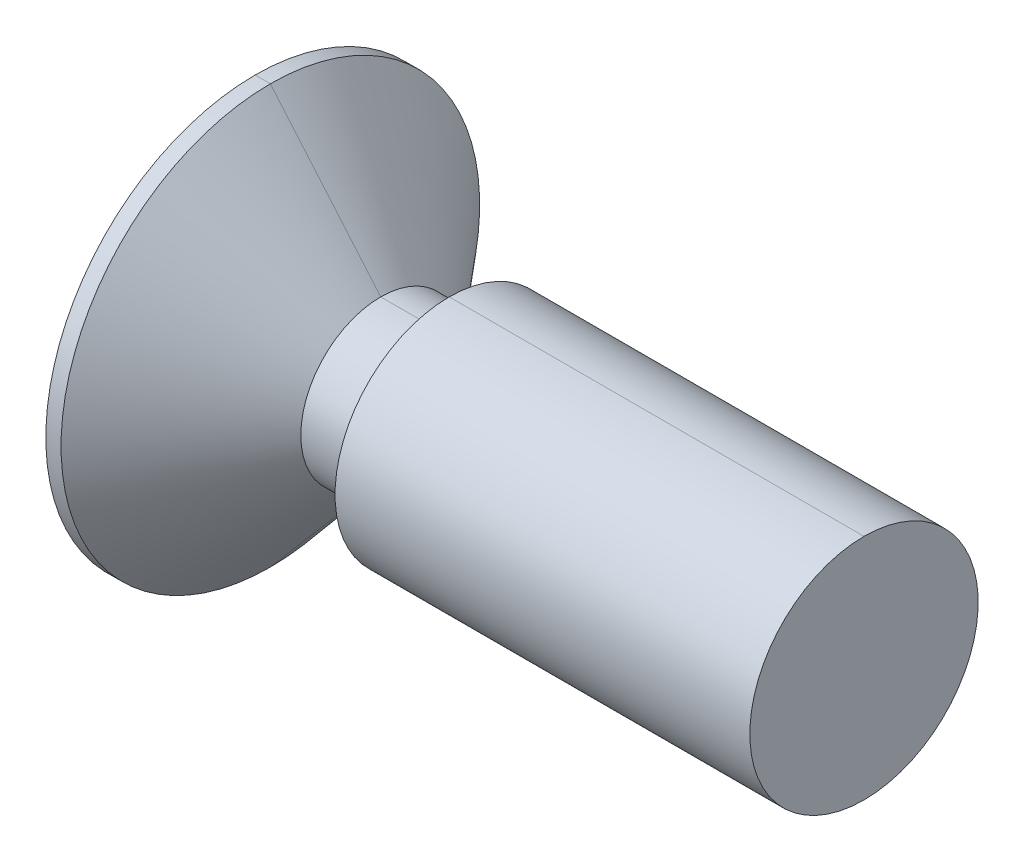
ISO-10303-21;
HEADER;
FILE_DESCRIPTION(('STEP AP214'),'2;1');
FILE_NAME('part.step','',(''),(''),'','','');
FILE_SCHEMA(('AUTOMOTIVE_DESIGN { 1 0 10303 214 1 1 1 1 }'));
ENDSEC;
DATA;
#1=APPLICATION_CONTEXT('core data for automotive mechanical design processes');
#2=APPLICATION_PROTOCOL_DEFINITION('international standard','automotive_design',2000,#1);
#3=PRODUCT_CONTEXT('',#1,'mechanical');
#4=PRODUCT('Part','Part','',(#3));
#5=PRODUCT_RELATED_PRODUCT_CATEGORY('part','',(#4));
#6=PRODUCT_DEFINITION_FORMATION('','',#4);
#7=PRODUCT_DEFINITION_CONTEXT('part definition',#1,'design');
#8=PRODUCT_DEFINITION('design','',#6,#7);
#9=PRODUCT_DEFINITION_SHAPE('','',#8);
#10=(LENGTH_UNIT() NAMED_UNIT(*) SI_UNIT(.MILLI.,.METRE.));
#11=(NAMED_UNIT(*) PLANE_ANGLE_UNIT() SI_UNIT($,.RADIAN.));
#12=(NAMED_UNIT(*) SI_UNIT($,.STERADIAN.) SOLID_ANGLE_UNIT());
#13=UNCERTAINTY_MEASURE_WITH_UNIT(LENGTH_MEASURE(1.E-05),#10,'distance_accuracy_value','');
#14=(GEOMETRIC_REPRESENTATION_CONTEXT(3) GLOBAL_UNCERTAINTY_ASSIGNED_CONTEXT((#13)) GLOBAL_UNIT_ASSIGNED_CONTEXT((#10,
#11,#12)) REPRESENTATION_CONTEXT('',''));
#15=CARTESIAN_POINT('',(0.,0.,0.));
#16=DIRECTION('',(0.,0.,1.));
#17=DIRECTION('',(1.,0.,0.));
#18=AXIS2_PLACEMENT_3D('',#15,#16,#17);
#19=CARTESIAN_POINT('',(-7.175,0.675,-0.675));
#20=DIRECTION('',(1.,0.,0.));
#21=DIRECTION('',(0.,1.,0.));
#22=AXIS2_PLACEMENT_3D('',#19,#20,#21);
#23=PLANE('',#22);
#24=DIRECTION('',(0.,-1.,0.));
#25=VECTOR('',#24,1.);
#26=CARTESIAN_POINT('',(-7.175,1.8,-0.375));
#27=LINE('',#26,#25);
#28=CARTESIAN_POINT('',(-7.175,1.8,-0.375));
#29=VERTEX_POINT('',#28);
#30=CARTESIAN_POINT('',(-7.175,0.675,-0.375));
#31=VERTEX_POINT('',#30);
#32=EDGE_CURVE('E343',#29,#31,#27,.T.);
#33=ORIENTED_EDGE('',*,*,#32,.T.);
#34=CARTESIAN_POINT('',(-7.175,0.675,-0.675));
#35=DIRECTION('',(1.,0.,0.));
#36=DIRECTION('',(0.,1.,0.));
#37=AXIS2_PLACEMENT_3D('',#34,#35,#36);
#38=CIRCLE('',#37,0.3);
#39=CARTESIAN_POINT('',(-7.175,0.375,-0.675));
#40=VERTEX_POINT('',#39);
#41=EDGE_CURVE('E10',#31,#40,#38,.T.);
#42=ORIENTED_EDGE('',*,*,#41,.T.);
#43=DIRECTION('',(0.,0.,-1.));
#44=VECTOR('',#43,1.);
#45=CARTESIAN_POINT('',(-7.175,0.375,-1.8));
#46=LINE('',#45,#44);
#47=CARTESIAN_POINT('',(-7.175,0.375,-1.8));
#48=VERTEX_POINT('',#47);
#49=EDGE_CURVE('E345',#40,#48,#46,.T.);
#50=ORIENTED_EDGE('',*,*,#49,.T.);
#51=DIRECTION('',(0.,-1.,0.));
#52=VECTOR('',#51,1.);
#53=CARTESIAN_POINT('',(-7.175,0.375,-1.8));
#54=LINE('',#53,#52);
#55=CARTESIAN_POINT('',(-7.175,-0.375,-1.8));
#56=VERTEX_POINT('',#55);
#57=EDGE_CURVE('E281',#48,#56,#54,.T.);
#58=ORIENTED_EDGE('',*,*,#57,.T.);
#59=DIRECTION('',(0.,0.,1.));
#60=VECTOR('',#59,1.);
#61=CARTESIAN_POINT('',(-7.175,-0.375,-1.8));
#62=LINE('',#61,#60);
#63=CARTESIAN_POINT('',(-7.175,-0.375,-0.675));
#64=VERTEX_POINT('',#63);
#65=EDGE_CURVE('E20',#56,#64,#62,.T.);
#66=ORIENTED_EDGE('',*,*,#65,.T.);
#67=CARTESIAN_POINT('',(-7.175,-0.675,-0.675));
#68=DIRECTION('',(1.,0.,0.));
#69=DIRECTION('',(0.,-1.,0.));
#70=AXIS2_PLACEMENT_3D('',#67,#68,#69);
#71=CIRCLE('',#70,0.3);
#72=CARTESIAN_POINT('',(-7.175,-0.675,-0.375));
#73=VERTEX_POINT('',#72);
#74=EDGE_CURVE('E277',#64,#73,#71,.T.);
#75=ORIENTED_EDGE('',*,*,#74,.T.);
#76=DIRECTION('',(0.,-1.,0.));
#77=VECTOR('',#76,1.);
#78=CARTESIAN_POINT('',(-7.175,-0.675,-0.375));
#79=LINE('',#78,#77);
#80=CARTESIAN_POINT('',(-7.175,-1.8,-0.375));
#81=VERTEX_POINT('',#80);
#82=EDGE_CURVE('E270',#73,#81,#79,.T.);
#83=ORIENTED_EDGE('',*,*,#82,.T.);
#84=DIRECTION('',(0.,0.,1.));
#85=VECTOR('',#84,1.);
#86=CARTESIAN_POINT('',(-7.175,-1.8,-0.375));
#87=LINE('',#86,#85);
#88=CARTESIAN_POINT('',(-7.175,-1.8,0.375));
#89=VERTEX_POINT('',#88);
#90=EDGE_CURVE('E365',#81,#89,#87,.T.);
#91=ORIENTED_EDGE('',*,*,#90,.T.);
#92=DIRECTION('',(0.,1.,0.));
#93=VECTOR('',#92,1.);
#94=CARTESIAN_POINT('',(-7.175,-0.675,0.375));
#95=LINE('',#94,#93);
#96=CARTESIAN_POINT('',(-7.175,-0.675,0.375));
#97=VERTEX_POINT('',#96);
#98=EDGE_CURVE('E366',#89,#97,#95,.T.);
#99=ORIENTED_EDGE('',*,*,#98,.T.);
#100=CARTESIAN_POINT('',(-7.175,-0.675,0.675));
#101=DIRECTION('',(1.,0.,0.));
#102=DIRECTION('',(0.,1.,0.));
#103=AXIS2_PLACEMENT_3D('',#100,#101,#102);
#104=CIRCLE('',#103,0.3);
#105=CARTESIAN_POINT('',(-7.175,-0.375,0.675));
#106=VERTEX_POINT('',#105);
#107=EDGE_CURVE('E295',#97,#106,#104,.T.);
#108=ORIENTED_EDGE('',*,*,#107,.T.);
#109=DIRECTION('',(0.,0.,1.));
#110=VECTOR('',#109,1.);
#111=CARTESIAN_POINT('',(-7.175,-0.375,0.675));
#112=LINE('',#111,#110);
#113=CARTESIAN_POINT('',(-7.175,-0.375,1.8));
#114=VERTEX_POINT('',#113);
#115=EDGE_CURVE('E296',#106,#114,#112,.T.);
#116=ORIENTED_EDGE('',*,*,#115,.T.);
#117=DIRECTION('',(0.,1.,0.));
#118=VECTOR('',#117,1.);
#119=CARTESIAN_POINT('',(-7.175,0.375,1.8));
#120=LINE('',#119,#118);
#121=CARTESIAN_POINT('',(-7.175,0.375,1.8));
#122=VERTEX_POINT('',#121);
#123=EDGE_CURVE('E259',#114,#122,#120,.T.);
#124=ORIENTED_EDGE('',*,*,#123,.T.);
#125=DIRECTION('',(0.,0.,-1.));
#126=VECTOR('',#125,1.);
#127=CARTESIAN_POINT('',(-7.175,0.375,0.675));
#128=LINE('',#127,#126);
#129=CARTESIAN_POINT('',(-7.175,0.375,0.675));
#130=VERTEX_POINT('',#129);
#131=EDGE_CURVE('E304',#122,#130,#128,.T.);
#132=ORIENTED_EDGE('',*,*,#131,.T.);
#133=CARTESIAN_POINT('',(-7.175,0.675,0.675));
#134=DIRECTION('',(1.,0.,0.));
#135=DIRECTION('',(0.,1.,0.));
#136=AXIS2_PLACEMENT_3D('',#133,#134,#135);
#137=CIRCLE('',#136,0.3);
#138=CARTESIAN_POINT('',(-7.175,0.675,0.375));
#139=VERTEX_POINT('',#138);
#140=EDGE_CURVE('E389',#130,#139,#137,.T.);
#141=ORIENTED_EDGE('',*,*,#140,.T.);
#142=DIRECTION('',(0.,1.,0.));
#143=VECTOR('',#142,1.);
#144=CARTESIAN_POINT('',(-7.175,1.8,0.375));
#145=LINE('',#144,#143);
#146=CARTESIAN_POINT('',(-7.175,1.8,0.375));
#147=VERTEX_POINT('',#146);
#148=EDGE_CURVE('E327',#139,#147,#145,.T.);
#149=ORIENTED_EDGE('',*,*,#148,.T.);
#150=DIRECTION('',(0.,0.,-1.));
#151=VECTOR('',#150,1.);
#152=CARTESIAN_POINT('',(-7.175,1.8,-0.375));
#153=LINE('',#152,#151);
#154=EDGE_CURVE('E312',#147,#29,#153,.T.);
#155=ORIENTED_EDGE('',*,*,#154,.T.);
#156=EDGE_LOOP('',(#33,#42,#50,#58,#66,#75,#83,#91,#99,#108,#116,#124,#132,#141,#149,#155));
#157=FACE_BOUND('',#156,.T.);
#158=ADVANCED_FACE('F16',(#157),#23,.F.);
#159=CARTESIAN_POINT('',(-7.175,0.675,-0.675));
#160=DIRECTION('',(-1.,0.,0.));
#161=DIRECTION('',(0.,-1.,0.));
#162=AXIS2_PLACEMENT_3D('',#159,#160,#161);
#163=CYLINDRICAL_SURFACE('',#162,0.3);
#164=CARTESIAN_POINT('',(-8.,0.675,-0.675));
#165=DIRECTION('',(1.,0.,0.));
#166=DIRECTION('',(0.,1.,0.));
#167=AXIS2_PLACEMENT_3D('',#164,#165,#166);
#168=CIRCLE('',#167,0.3);
#169=CARTESIAN_POINT('',(-8.,0.675,-0.375));
#170=VERTEX_POINT('',#169);
#171=CARTESIAN_POINT('',(-8.,0.375,-0.675));
#172=VERTEX_POINT('',#171);
#173=EDGE_CURVE('E344',#170,#172,#168,.T.);
#174=ORIENTED_EDGE('',*,*,#173,.T.);
#175=DIRECTION('',(-1.,0.,0.));
#176=VECTOR('',#175,1.);
#177=CARTESIAN_POINT('',(-7.175,0.375,-0.675));
#178=LINE('',#177,#176);
#179=EDGE_CURVE('E27',#40,#172,#178,.T.);
#180=ORIENTED_EDGE('',*,*,#179,.F.);
#181=ORIENTED_EDGE('',*,*,#41,.F.);
#182=DIRECTION('',(-1.,0.,0.));
#183=VECTOR('',#182,1.);
#184=CARTESIAN_POINT('',(-7.175,0.675,-0.375));
#185=LINE('',#184,#183);
#186=EDGE_CURVE('E340',#31,#170,#185,.T.);
#187=ORIENTED_EDGE('',*,*,#186,.T.);
#188=EDGE_LOOP('',(#174,#180,#181,#187));
#189=FACE_BOUND('',#188,.T.);
#190=ADVANCED_FACE('F475',(#189),#163,.T.);
#191=CARTESIAN_POINT('',(-7.175,0.375,-1.8));
#192=DIRECTION('',(0.,1.,0.));
#193=DIRECTION('',(1.,0.,0.));
#194=AXIS2_PLACEMENT_3D('',#191,#192,#193);
#195=PLANE('',#194);
#196=DIRECTION('',(0.,0.,-1.));
#197=VECTOR('',#196,1.);
#198=CARTESIAN_POINT('',(-8.,0.375,-1.8));
#199=LINE('',#198,#197);
#200=CARTESIAN_POINT('',(-8.,0.375,-1.8));
#201=VERTEX_POINT('',#200);
#202=EDGE_CURVE('E321',#172,#201,#199,.T.);
#203=ORIENTED_EDGE('',*,*,#202,.T.);
#204=DIRECTION('',(-1.,0.,0.));
#205=VECTOR('',#204,1.);
#206=CARTESIAN_POINT('',(-7.175,0.375,-1.8));
#207=LINE('',#206,#205);
#208=EDGE_CURVE('E290',#48,#201,#207,.T.);
#209=ORIENTED_EDGE('',*,*,#208,.F.);
#210=ORIENTED_EDGE('',*,*,#49,.F.);
#211=ORIENTED_EDGE('',*,*,#179,.T.);
#212=EDGE_LOOP('',(#203,#209,#210,#211));
#213=FACE_BOUND('',#212,.T.);
#214=ADVANCED_FACE('F482',(#213),#195,.F.);
#215=CARTESIAN_POINT('',(-7.175,0.375,-1.8));
#216=DIRECTION('',(0.,0.,-1.));
#217=DIRECTION('',(0.,-1.,0.));
#218=AXIS2_PLACEMENT_3D('',#215,#216,#217);
#219=PLANE('',#218);
#220=DIRECTION('',(0.,-1.,0.));
#221=VECTOR('',#220,1.);
#222=CARTESIAN_POINT('',(-8.,0.375,-1.8));
#223=LINE('',#222,#221);
#224=CARTESIAN_POINT('',(-8.,-0.375,-1.8));
#225=VERTEX_POINT('',#224);
#226=EDGE_CURVE('E317',#201,#225,#223,.T.);
#227=ORIENTED_EDGE('',*,*,#226,.T.);
#228=DIRECTION('',(-1.,0.,0.));
#229=VECTOR('',#228,1.);
#230=CARTESIAN_POINT('',(-7.175,-0.375,-1.8));
#231=LINE('',#230,#229);
#232=EDGE_CURVE('E278',#56,#225,#231,.T.);
#233=ORIENTED_EDGE('',*,*,#232,.F.);
#234=ORIENTED_EDGE('',*,*,#57,.F.);
#235=ORIENTED_EDGE('',*,*,#208,.T.);
#236=EDGE_LOOP('',(#227,#233,#234,#235));
#237=FACE_BOUND('',#236,.T.);
#238=ADVANCED_FACE('F488',(#237),#219,.F.);
#239=CARTESIAN_POINT('',(-7.175,-0.375,-1.8));
#240=DIRECTION('',(0.,-1.,0.));
#241=DIRECTION('',(0.,0.,-1.));
#242=AXIS2_PLACEMENT_3D('',#239,#240,#241);
#243=PLANE('',#242);
#244=DIRECTION('',(0.,0.,1.));
#245=VECTOR('',#244,1.);
#246=CARTESIAN_POINT('',(-8.,-0.375,-1.8));
#247=LINE('',#246,#245);
#248=CARTESIAN_POINT('',(-8.,-0.375,-0.675));
#249=VERTEX_POINT('',#248);
#250=EDGE_CURVE('E322',#225,#249,#247,.T.);
#251=ORIENTED_EDGE('',*,*,#250,.T.);
#252=DIRECTION('',(-1.,0.,0.));
#253=VECTOR('',#252,1.);
#254=CARTESIAN_POINT('',(-7.175,-0.375,-0.675));
#255=LINE('',#254,#253);
#256=EDGE_CURVE('E336',#64,#249,#255,.T.);
#257=ORIENTED_EDGE('',*,*,#256,.F.);
#258=ORIENTED_EDGE('',*,*,#65,.F.);
#259=ORIENTED_EDGE('',*,*,#232,.T.);
#260=EDGE_LOOP('',(#251,#257,#258,#259));
#261=FACE_BOUND('',#260,.T.);
#262=ADVANCED_FACE('F490',(#261),#243,.F.);
#263=CARTESIAN_POINT('',(-7.175,-0.675,-0.675));
#264=DIRECTION('',(-1.,0.,0.));
#265=DIRECTION('',(0.,-1.,0.));
#266=AXIS2_PLACEMENT_3D('',#263,#264,#265);
#267=CYLINDRICAL_SURFACE('',#266,0.3);
#268=CARTESIAN_POINT('',(-8.,-0.675,-0.675));
#269=DIRECTION('',(1.,0.,0.));
#270=DIRECTION('',(0.,-1.,0.));
#271=AXIS2_PLACEMENT_3D('',#268,#269,#270);
#272=CIRCLE('',#271,0.3);
#273=CARTESIAN_POINT('',(-8.,-0.675,-0.375));
#274=VERTEX_POINT('',#273);
#275=EDGE_CURVE('E257',#249,#274,#272,.T.);
#276=ORIENTED_EDGE('',*,*,#275,.T.);
#277=DIRECTION('',(-1.,0.,0.));
#278=VECTOR('',#277,1.);
#279=CARTESIAN_POINT('',(-7.175,-0.675,-0.375));
#280=LINE('',#279,#278);
#281=EDGE_CURVE('E273',#73,#274,#280,.T.);
#282=ORIENTED_EDGE('',*,*,#281,.F.);
#283=ORIENTED_EDGE('',*,*,#74,.F.);
#284=ORIENTED_EDGE('',*,*,#256,.T.);
#285=EDGE_LOOP('',(#276,#282,#283,#284));
#286=FACE_BOUND('',#285,.T.);
#287=ADVANCED_FACE('F646',(#286),#267,.T.);
#288=CARTESIAN_POINT('',(-7.175,-0.675,-0.375));
#289=DIRECTION('',(0.,0.,-1.));
#290=DIRECTION('',(0.,-1.,0.));
#291=AXIS2_PLACEMENT_3D('',#288,#289,#290);
#292=PLANE('',#291);
#293=DIRECTION('',(0.,-1.,0.));
#294=VECTOR('',#293,1.);
#295=CARTESIAN_POINT('',(-8.,-0.675,-0.375));
#296=LINE('',#295,#294);
#297=CARTESIAN_POINT('',(-8.,-1.8,-0.375));
#298=VERTEX_POINT('',#297);
#299=EDGE_CURVE('E253',#274,#298,#296,.T.);
#300=ORIENTED_EDGE('',*,*,#299,.T.);
#301=DIRECTION('',(-1.,0.,0.));
#302=VECTOR('',#301,1.);
#303=CARTESIAN_POINT('',(-7.175,-1.8,-0.375));
#304=LINE('',#303,#302);
#305=EDGE_CURVE('E274',#81,#298,#304,.T.);
#306=ORIENTED_EDGE('',*,*,#305,.F.);
#307=ORIENTED_EDGE('',*,*,#82,.F.);
#308=ORIENTED_EDGE('',*,*,#281,.T.);
#309=EDGE_LOOP('',(#300,#306,#307,#308));
#310=FACE_BOUND('',#309,.T.);
#311=ADVANCED_FACE('F634',(#310),#292,.F.);
#312=CARTESIAN_POINT('',(-7.175,-1.8,-0.375));
#313=DIRECTION('',(0.,-1.,0.));
#314=DIRECTION('',(0.,0.,-1.));
#315=AXIS2_PLACEMENT_3D('',#312,#313,#314);
#316=PLANE('',#315);
#317=DIRECTION('',(0.,0.,1.));
#318=VECTOR('',#317,1.);
#319=CARTESIAN_POINT('',(-8.,-1.8,-0.375));
#320=LINE('',#319,#318);
#321=CARTESIAN_POINT('',(-8.,-1.8,0.375));
#322=VERTEX_POINT('',#321);
#323=EDGE_CURVE('E258',#298,#322,#320,.T.);
#324=ORIENTED_EDGE('',*,*,#323,.T.);
#325=DIRECTION('',(-1.,0.,0.));
#326=VECTOR('',#325,1.);
#327=CARTESIAN_POINT('',(-7.175,-1.8,0.375));
#328=LINE('',#327,#326);
#329=EDGE_CURVE('E362',#89,#322,#328,.T.);
#330=ORIENTED_EDGE('',*,*,#329,.F.);
#331=ORIENTED_EDGE('',*,*,#90,.F.);
#332=ORIENTED_EDGE('',*,*,#305,.T.);
#333=EDGE_LOOP('',(#324,#330,#331,#332));
#334=FACE_BOUND('',#333,.T.);
#335=ADVANCED_FACE('F565',(#334),#316,.F.);
#336=CARTESIAN_POINT('',(-7.175,-0.675,0.375));
#337=DIRECTION('',(0.,0.,1.));
#338=DIRECTION('',(0.,-1.,0.));
#339=AXIS2_PLACEMENT_3D('',#336,#337,#338);
#340=PLANE('',#339);
#341=DIRECTION('',(0.,1.,0.));
#342=VECTOR('',#341,1.);
#343=CARTESIAN_POINT('',(-8.,-0.675,0.375));
#344=LINE('',#343,#342);
#345=CARTESIAN_POINT('',(-8.,-0.675,0.375));
#346=VERTEX_POINT('',#345);
#347=EDGE_CURVE('E246',#322,#346,#344,.T.);
#348=ORIENTED_EDGE('',*,*,#347,.T.);
#349=DIRECTION('',(-1.,0.,0.));
#350=VECTOR('',#349,1.);
#351=CARTESIAN_POINT('',(-7.175,-0.675,0.375));
#352=LINE('',#351,#350);
#353=EDGE_CURVE('E333',#97,#346,#352,.T.);
#354=ORIENTED_EDGE('',*,*,#353,.F.);
#355=ORIENTED_EDGE('',*,*,#98,.F.);
#356=ORIENTED_EDGE('',*,*,#329,.T.);
#357=EDGE_LOOP('',(#348,#354,#355,#356));
#358=FACE_BOUND('',#357,.T.);
#359=ADVANCED_FACE('F445',(#358),#340,.F.);
#360=CARTESIAN_POINT('',(-7.175,-0.675,0.675));
#361=DIRECTION('',(-1.,0.,0.));
#362=DIRECTION('',(0.,-1.,0.));
#363=AXIS2_PLACEMENT_3D('',#360,#361,#362);
#364=CYLINDRICAL_SURFACE('',#363,0.3);
#365=CARTESIAN_POINT('',(-8.,-0.675,0.675));
#366=DIRECTION('',(1.,0.,0.));
#367=DIRECTION('',(0.,1.,0.));
#368=AXIS2_PLACEMENT_3D('',#365,#366,#367);
#369=CIRCLE('',#368,0.3);
#370=CARTESIAN_POINT('',(-8.,-0.375,0.675));
#371=VERTEX_POINT('',#370);
#372=EDGE_CURVE('E268',#346,#371,#369,.T.);
#373=ORIENTED_EDGE('',*,*,#372,.T.);
#374=DIRECTION('',(-1.,0.,0.));
#375=VECTOR('',#374,1.);
#376=CARTESIAN_POINT('',(-7.175,-0.375,0.675));
#377=LINE('',#376,#375);
#378=EDGE_CURVE('E291',#106,#371,#377,.T.);
#379=ORIENTED_EDGE('',*,*,#378,.F.);
#380=ORIENTED_EDGE('',*,*,#107,.F.);
#381=ORIENTED_EDGE('',*,*,#353,.T.);
#382=EDGE_LOOP('',(#373,#379,#380,#381));
#383=FACE_BOUND('',#382,.T.);
#384=ADVANCED_FACE('F438',(#383),#364,.T.);
#385=CARTESIAN_POINT('',(-7.175,-0.375,0.675));
#386=DIRECTION('',(0.,-1.,0.));
#387=DIRECTION('',(0.,0.,-1.));
#388=AXIS2_PLACEMENT_3D('',#385,#386,#387);
#389=PLANE('',#388);
#390=DIRECTION('',(0.,0.,1.));
#391=VECTOR('',#390,1.);
#392=CARTESIAN_POINT('',(-8.,-0.375,0.675));
#393=LINE('',#392,#391);
#394=CARTESIAN_POINT('',(-8.,-0.375,1.8));
#395=VERTEX_POINT('',#394);
#396=EDGE_CURVE('E264',#371,#395,#393,.T.);
#397=ORIENTED_EDGE('',*,*,#396,.T.);
#398=DIRECTION('',(-1.,0.,0.));
#399=VECTOR('',#398,1.);
#400=CARTESIAN_POINT('',(-7.175,-0.375,1.8));
#401=LINE('',#400,#399);
#402=EDGE_CURVE('E262',#114,#395,#401,.T.);
#403=ORIENTED_EDGE('',*,*,#402,.F.);
#404=ORIENTED_EDGE('',*,*,#115,.F.);
#405=ORIENTED_EDGE('',*,*,#378,.T.);
#406=EDGE_LOOP('',(#397,#403,#404,#405));
#407=FACE_BOUND('',#406,.T.);
#408=ADVANCED_FACE('F506',(#407),#389,.F.);
#409=CARTESIAN_POINT('',(-7.175,0.375,1.8));
#410=DIRECTION('',(0.,0.,1.));
#411=DIRECTION('',(1.,0.,0.));
#412=AXIS2_PLACEMENT_3D('',#409,#410,#411);
#413=PLANE('',#412);
#414=DIRECTION('',(0.,1.,0.));
#415=VECTOR('',#414,1.);
#416=CARTESIAN_POINT('',(-8.,0.375,1.8));
#417=LINE('',#416,#415);
#418=CARTESIAN_POINT('',(-8.,0.375,1.8));
#419=VERTEX_POINT('',#418);
#420=EDGE_CURVE('E269',#395,#419,#417,.T.);
#421=ORIENTED_EDGE('',*,*,#420,.T.);
#422=DIRECTION('',(-1.,0.,0.));
#423=VECTOR('',#422,1.);
#424=CARTESIAN_POINT('',(-7.175,0.375,1.8));
#425=LINE('',#424,#423);
#426=EDGE_CURVE('E263',#122,#419,#425,.T.);
#427=ORIENTED_EDGE('',*,*,#426,.F.);
#428=ORIENTED_EDGE('',*,*,#123,.F.);
#429=ORIENTED_EDGE('',*,*,#402,.T.);
#430=EDGE_LOOP('',(#421,#427,#428,#429));
#431=FACE_BOUND('',#430,.T.);
#432=ADVANCED_FACE('F500',(#431),#413,.F.);
#433=CARTESIAN_POINT('',(-7.175,0.375,0.675));
#434=DIRECTION('',(0.,1.,0.));
#435=DIRECTION('',(0.,0.,-1.));
#436=AXIS2_PLACEMENT_3D('',#433,#434,#435);
#437=PLANE('',#436);
#438=DIRECTION('',(0.,0.,-1.));
#439=VECTOR('',#438,1.);
#440=CARTESIAN_POINT('',(-8.,0.375,0.675));
#441=LINE('',#440,#439);
#442=CARTESIAN_POINT('',(-8.,0.375,0.675));
#443=VERTEX_POINT('',#442);
#444=EDGE_CURVE('E416',#419,#443,#441,.T.);
#445=ORIENTED_EDGE('',*,*,#444,.T.);
#446=DIRECTION('',(-1.,0.,0.));
#447=VECTOR('',#446,1.);
#448=CARTESIAN_POINT('',(-7.175,0.375,0.675));
#449=LINE('',#448,#447);
#450=EDGE_CURVE('E392',#130,#443,#449,.T.);
#451=ORIENTED_EDGE('',*,*,#450,.F.);
#452=ORIENTED_EDGE('',*,*,#131,.F.);
#453=ORIENTED_EDGE('',*,*,#426,.T.);
#454=EDGE_LOOP('',(#445,#451,#452,#453));
#455=FACE_BOUND('',#454,.T.);
#456=ADVANCED_FACE('F505',(#455),#437,.F.);
#457=CARTESIAN_POINT('',(-7.175,0.675,0.675));
#458=DIRECTION('',(-1.,0.,0.));
#459=DIRECTION('',(0.,-1.,0.));
#460=AXIS2_PLACEMENT_3D('',#457,#458,#459);
#461=CYLINDRICAL_SURFACE('',#460,0.3);
#462=CARTESIAN_POINT('',(-8.,0.675,0.675));
#463=DIRECTION('',(1.,0.,0.));
#464=DIRECTION('',(0.,1.,0.));
#465=AXIS2_PLACEMENT_3D('',#462,#463,#464);
#466=CIRCLE('',#465,0.3);
#467=CARTESIAN_POINT('',(-8.,0.675,0.375));
#468=VERTEX_POINT('',#467);
#469=EDGE_CURVE('E427',#443,#468,#466,.T.);
#470=ORIENTED_EDGE('',*,*,#469,.T.);
#471=DIRECTION('',(-1.,0.,0.));
#472=VECTOR('',#471,1.);
#473=CARTESIAN_POINT('',(-7.175,0.675,0.375));
#474=LINE('',#473,#472);
#475=EDGE_CURVE('E386',#139,#468,#474,.T.);
#476=ORIENTED_EDGE('',*,*,#475,.F.);
#477=ORIENTED_EDGE('',*,*,#140,.F.);
#478=ORIENTED_EDGE('',*,*,#450,.T.);
#479=EDGE_LOOP('',(#470,#476,#477,#478));
#480=FACE_BOUND('',#479,.T.);
#481=ADVANCED_FACE('F719',(#480),#461,.T.);
#482=CARTESIAN_POINT('',(-7.175,1.8,0.375));
#483=DIRECTION('',(0.,0.,1.));
#484=DIRECTION('',(0.,-1.,0.));
#485=AXIS2_PLACEMENT_3D('',#482,#483,#484);
#486=PLANE('',#485);
#487=DIRECTION('',(0.,1.,0.));
#488=VECTOR('',#487,1.);
#489=CARTESIAN_POINT('',(-8.,1.8,0.375));
#490=LINE('',#489,#488);
#491=CARTESIAN_POINT('',(-8.,1.8,0.375));
#492=VERTEX_POINT('',#491);
#493=EDGE_CURVE('E251',#468,#492,#490,.T.);
#494=ORIENTED_EDGE('',*,*,#493,.T.);
#495=DIRECTION('',(-1.,0.,0.));
#496=VECTOR('',#495,1.);
#497=CARTESIAN_POINT('',(-7.175,1.8,0.375));
#498=LINE('',#497,#496);
#499=EDGE_CURVE('E315',#147,#492,#498,.T.);
#500=ORIENTED_EDGE('',*,*,#499,.F.);
#501=ORIENTED_EDGE('',*,*,#148,.F.);
#502=ORIENTED_EDGE('',*,*,#475,.T.);
#503=EDGE_LOOP('',(#494,#500,#501,#502));
#504=FACE_BOUND('',#503,.T.);
#505=ADVANCED_FACE('F601',(#504),#486,.F.);
#506=CARTESIAN_POINT('',(-7.175,1.8,-0.375));
#507=DIRECTION('',(0.,1.,0.));
#508=DIRECTION('',(0.,0.,-1.));
#509=AXIS2_PLACEMENT_3D('',#506,#507,#508);
#510=PLANE('',#509);
#511=DIRECTION('',(0.,0.,-1.));
#512=VECTOR('',#511,1.);
#513=CARTESIAN_POINT('',(-8.,1.8,-0.375));
#514=LINE('',#513,#512);
#515=CARTESIAN_POINT('',(-8.,1.8,-0.375));
#516=VERTEX_POINT('',#515);
#517=EDGE_CURVE('E248',#492,#516,#514,.T.);
#518=ORIENTED_EDGE('',*,*,#517,.T.);
#519=DIRECTION('',(-1.,0.,0.));
#520=VECTOR('',#519,1.);
#521=CARTESIAN_POINT('',(-7.175,1.8,-0.375));
#522=LINE('',#521,#520);
#523=EDGE_CURVE('E316',#29,#516,#522,.T.);
#524=ORIENTED_EDGE('',*,*,#523,.F.);
#525=ORIENTED_EDGE('',*,*,#154,.F.);
#526=ORIENTED_EDGE('',*,*,#499,.T.);
#527=EDGE_LOOP('',(#518,#524,#525,#526));
#528=FACE_BOUND('',#527,.T.);
#529=ADVANCED_FACE('F522',(#528),#510,.F.);
#530=CARTESIAN_POINT('',(-7.175,1.8,-0.375));
#531=DIRECTION('',(0.,0.,-1.));
#532=DIRECTION('',(0.,-1.,0.));
#533=AXIS2_PLACEMENT_3D('',#530,#531,#532);
#534=PLANE('',#533);
#535=DIRECTION('',(0.,-1.,0.));
#536=VECTOR('',#535,1.);
#537=CARTESIAN_POINT('',(-8.,1.8,-0.375));
#538=LINE('',#537,#536);
#539=EDGE_CURVE('E252',#516,#170,#538,.T.);
#540=ORIENTED_EDGE('',*,*,#539,.T.);
#541=ORIENTED_EDGE('',*,*,#186,.F.);
#542=ORIENTED_EDGE('',*,*,#32,.F.);
#543=ORIENTED_EDGE('',*,*,#523,.T.);
#544=EDGE_LOOP('',(#540,#541,#542,#543));
#545=FACE_BOUND('',#544,.T.);
#546=ADVANCED_FACE('F517',(#545),#534,.F.);
#547=CARTESIAN_POINT('',(-8.,2.75,0.));
#548=DIRECTION('',(-1.,0.,0.));
#549=DIRECTION('',(0.,1.,0.));
#550=AXIS2_PLACEMENT_3D('',#547,#548,#549);
#551=PLANE('',#550);
#552=ORIENTED_EDGE('',*,*,#539,.F.);
#553=ORIENTED_EDGE('',*,*,#517,.F.);
#554=ORIENTED_EDGE('',*,*,#493,.F.);
#555=ORIENTED_EDGE('',*,*,#469,.F.);
#556=ORIENTED_EDGE('',*,*,#444,.F.);
#557=ORIENTED_EDGE('',*,*,#420,.F.);
#558=ORIENTED_EDGE('',*,*,#396,.F.);
#559=ORIENTED_EDGE('',*,*,#372,.F.);
#560=ORIENTED_EDGE('',*,*,#347,.F.);
#561=ORIENTED_EDGE('',*,*,#323,.F.);
#562=ORIENTED_EDGE('',*,*,#299,.F.);
#563=ORIENTED_EDGE('',*,*,#275,.F.);
#564=ORIENTED_EDGE('',*,*,#250,.F.);
#565=ORIENTED_EDGE('',*,*,#226,.F.);
#566=ORIENTED_EDGE('',*,*,#202,.F.);
#567=ORIENTED_EDGE('',*,*,#173,.F.);
#568=EDGE_LOOP('',(#552,#553,#554,#555,#556,#557,#558,#559,#560,#561,#562,#563,#564,#565,#566,#567));
#569=FACE_BOUND('',#568,.T.);
#570=CARTESIAN_POINT('',(-8.,0.,0.));
#571=DIRECTION('',(1.,0.,0.));
#572=DIRECTION('',(0.,1.,0.));
#573=AXIS2_PLACEMENT_3D('',#570,#571,#572);
#574=CIRCLE('',#573,2.75);
#575=CARTESIAN_POINT('',(-8.,2.75,0.));
#576=VERTEX_POINT('',#575);
#577=CARTESIAN_POINT('',(-8.,-2.75,0.));
#578=VERTEX_POINT('',#577);
#579=EDGE_CURVE('E354',#576,#578,#574,.T.);
#580=ORIENTED_EDGE('',*,*,#579,.F.);
#581=CARTESIAN_POINT('',(-8.,0.,0.));
#582=DIRECTION('',(1.,0.,0.));
#583=DIRECTION('',(0.,1.,0.));
#584=AXIS2_PLACEMENT_3D('',#581,#582,#583);
#585=CIRCLE('',#584,2.75);
#586=EDGE_CURVE('E285',#578,#576,#585,.T.);
#587=ORIENTED_EDGE('',*,*,#586,.F.);
#588=EDGE_LOOP('',(#580,#587));
#589=FACE_BOUND('',#588,.T.);
#590=ADVANCED_FACE('F450',(#569,#589),#551,.T.);
#591=CARTESIAN_POINT('',(0.,0.,0.));
#592=DIRECTION('',(1.,0.,0.));
#593=DIRECTION('',(0.,1.,0.));
#594=AXIS2_PLACEMENT_3D('',#591,#592,#593);
#595=CYLINDRICAL_SURFACE('',#594,2.75);
#596=DIRECTION('',(1.,0.,0.));
#597=VECTOR('',#596,1.);
#598=CARTESIAN_POINT('',(0.,-2.75,0.));
#599=LINE('',#598,#597);
#600=CARTESIAN_POINT('',(-7.8,-2.75,0.));
#601=VERTEX_POINT('',#600);
#602=EDGE_CURVE('E350',#578,#601,#599,.T.);
#603=ORIENTED_EDGE('',*,*,#602,.F.);
#604=ORIENTED_EDGE('',*,*,#586,.T.);
#605=DIRECTION('',(1.,0.,0.));
#606=VECTOR('',#605,1.);
#607=CARTESIAN_POINT('',(0.,2.75,0.));
#608=LINE('',#607,#606);
#609=CARTESIAN_POINT('',(-7.8,2.75,0.));
#610=VERTEX_POINT('',#609);
#611=EDGE_CURVE('E403',#576,#610,#608,.T.);
#612=ORIENTED_EDGE('',*,*,#611,.T.);
#613=CARTESIAN_POINT('',(-7.8,0.,0.));
#614=DIRECTION('',(1.,0.,0.));
#615=DIRECTION('',(0.,1.,0.));
#616=AXIS2_PLACEMENT_3D('',#613,#614,#615);
#617=CIRCLE('',#616,2.75);
#618=EDGE_CURVE('E337',#601,#610,#617,.T.);
#619=ORIENTED_EDGE('',*,*,#618,.F.);
#620=EDGE_LOOP('',(#603,#604,#612,#619));
#621=FACE_BOUND('',#620,.T.);
#622=ADVANCED_FACE('F623',(#621),#595,.T.);
#623=CARTESIAN_POINT('',(-6.35,0.,0.));
#624=DIRECTION('',(-1.,0.,0.));
#625=DIRECTION('',(0.,-1.,0.));
#626=AXIS2_PLACEMENT_3D('',#623,#624,#625);
#627=CONICAL_SURFACE('',#626,1.05,0.8645972343669);
#628=DIRECTION('',(-0.64894660608275,0.760833951959086,0.));
#629=VECTOR('',#628,1.);
#630=CARTESIAN_POINT('',(-6.35,1.05,0.));
#631=LINE('',#630,#629);
#632=CARTESIAN_POINT('',(-6.35,1.05,0.));
#633=VERTEX_POINT('',#632);
#634=EDGE_CURVE('E306',#633,#610,#631,.T.);
#635=ORIENTED_EDGE('',*,*,#634,.F.);
#636=CARTESIAN_POINT('',(-6.35,0.,0.));
#637=DIRECTION('',(1.,0.,0.));
#638=DIRECTION('',(0.,1.,0.));
#639=AXIS2_PLACEMENT_3D('',#636,#637,#638);
#640=CIRCLE('',#639,1.05);
#641=CARTESIAN_POINT('',(-6.35,-1.05,0.));
#642=VERTEX_POINT('',#641);
#643=EDGE_CURVE('E100',#642,#633,#640,.T.);
#644=ORIENTED_EDGE('',*,*,#643,.F.);
#645=DIRECTION('',(-0.64894660608275,-0.760833951959086,0.));
#646=VECTOR('',#645,1.);
#647=CARTESIAN_POINT('',(-6.35,-1.05,0.));
#648=LINE('',#647,#646);
#649=EDGE_CURVE('E310',#642,#601,#648,.T.);
#650=ORIENTED_EDGE('',*,*,#649,.T.);
#651=ORIENTED_EDGE('',*,*,#618,.T.);
#652=EDGE_LOOP('',(#635,#644,#650,#651));
#653=FACE_BOUND('',#652,.T.);
#654=ADVANCED_FACE('F537',(#653),#627,.T.);
#655=CARTESIAN_POINT('',(0.,0.,0.));
#656=DIRECTION('',(1.,0.,0.));
#657=DIRECTION('',(0.,1.,0.));
#658=AXIS2_PLACEMENT_3D('',#655,#656,#657);
#659=CYLINDRICAL_SURFACE('',#658,1.05);
#660=DIRECTION('',(1.,0.,0.));
#661=VECTOR('',#660,1.);
#662=CARTESIAN_POINT('',(0.,-1.05,0.));
#663=LINE('',#662,#661);
#664=CARTESIAN_POINT('',(-5.45,-1.05,0.));
#665=VERTEX_POINT('',#664);
#666=EDGE_CURVE('E299',#642,#665,#663,.T.);
#667=ORIENTED_EDGE('',*,*,#666,.F.);
#668=ORIENTED_EDGE('',*,*,#643,.T.);
#669=DIRECTION('',(1.,0.,0.));
#670=VECTOR('',#669,1.);
#671=CARTESIAN_POINT('',(0.,1.05,0.));
#672=LINE('',#671,#670);
#673=CARTESIAN_POINT('',(-5.45,1.05,0.));
#674=VERTEX_POINT('',#673);
#675=EDGE_CURVE('E235',#633,#674,#672,.T.);
#676=ORIENTED_EDGE('',*,*,#675,.T.);
#677=CARTESIAN_POINT('',(-5.45,0.,0.));
#678=DIRECTION('',(1.,0.,0.));
#679=DIRECTION('',(0.,1.,0.));
#680=AXIS2_PLACEMENT_3D('',#677,#678,#679);
#681=CIRCLE('',#680,1.05);
#682=EDGE_CURVE('E86',#665,#674,#681,.T.);
#683=ORIENTED_EDGE('',*,*,#682,.F.);
#684=EDGE_LOOP('',(#667,#668,#676,#683));
#685=FACE_BOUND('',#684,.T.);
#686=ADVANCED_FACE('F532',(#685),#659,.T.);
#687=CARTESIAN_POINT('',(-5.45,1.5,0.));
#688=DIRECTION('',(-1.,0.,0.));
#689=DIRECTION('',(0.,1.,0.));
#690=AXIS2_PLACEMENT_3D('',#687,#688,#689);
#691=PLANE('',#690);
#692=CARTESIAN_POINT('',(-5.45,0.,0.));
#693=DIRECTION('',(1.,0.,0.));
#694=DIRECTION('',(0.,1.,0.));
#695=AXIS2_PLACEMENT_3D('',#692,#693,#694);
#696=CIRCLE('',#695,1.05);
#697=EDGE_CURVE('E242',#674,#665,#696,.T.);
#698=ORIENTED_EDGE('',*,*,#697,.T.);
#699=ORIENTED_EDGE('',*,*,#682,.T.);
#700=EDGE_LOOP('',(#698,#699));
#701=FACE_BOUND('',#700,.T.);
#702=CARTESIAN_POINT('',(-5.45,0.,0.));
#703=DIRECTION('',(1.,0.,0.));
#704=DIRECTION('',(0.,1.,0.));
#705=AXIS2_PLACEMENT_3D('',#702,#703,#704);
#706=CIRCLE('',#705,1.5);
#707=CARTESIAN_POINT('',(-5.45,1.5,0.));
#708=VERTEX_POINT('',#707);
#709=CARTESIAN_POINT('',(-5.45,-1.5,0.));
#710=VERTEX_POINT('',#709);
#711=EDGE_CURVE('E217',#708,#710,#706,.T.);
#712=ORIENTED_EDGE('',*,*,#711,.F.);
#713=CARTESIAN_POINT('',(-5.45,0.,0.));
#714=DIRECTION('',(1.,0.,0.));
#715=DIRECTION('',(0.,1.,0.));
#716=AXIS2_PLACEMENT_3D('',#713,#714,#715);
#717=CIRCLE('',#716,1.5);
#718=EDGE_CURVE('E213',#710,#708,#717,.T.);
#719=ORIENTED_EDGE('',*,*,#718,.F.);
#720=EDGE_LOOP('',(#712,#719));
#721=FACE_BOUND('',#720,.T.);
#722=ADVANCED_FACE('F215',(#701,#721),#691,.T.);
#723=CARTESIAN_POINT('',(0.,0.,0.));
#724=DIRECTION('',(1.,0.,0.));
#725=DIRECTION('',(0.,1.,0.));
#726=AXIS2_PLACEMENT_3D('',#723,#724,#725);
#727=CYLINDRICAL_SURFACE('',#726,1.5);
#728=DIRECTION('',(1.,0.,0.));
#729=VECTOR('',#728,1.);
#730=CARTESIAN_POINT('',(0.,-1.5,0.));
#731=LINE('',#730,#729);
#732=CARTESIAN_POINT('',(0.,-1.5,0.));
#733=VERTEX_POINT('',#732);
#734=EDGE_CURVE('E225',#710,#733,#731,.T.);
#735=ORIENTED_EDGE('',*,*,#734,.F.);
#736=ORIENTED_EDGE('',*,*,#718,.T.);
#737=DIRECTION('',(1.,0.,0.));
#738=VECTOR('',#737,1.);
#739=CARTESIAN_POINT('',(0.,1.5,0.));
#740=LINE('',#739,#738);
#741=CARTESIAN_POINT('',(0.,1.5,0.));
#742=VERTEX_POINT('',#741);
#743=EDGE_CURVE('E233',#708,#742,#740,.T.);
#744=ORIENTED_EDGE('',*,*,#743,.T.);
#745=CARTESIAN_POINT('',(0.,0.,0.));
#746=DIRECTION('',(1.,0.,0.));
#747=DIRECTION('',(0.,1.,0.));
#748=AXIS2_PLACEMENT_3D('',#745,#746,#747);
#749=CIRCLE('',#748,1.5);
#750=EDGE_CURVE('E222',#733,#742,#749,.T.);
#751=ORIENTED_EDGE('',*,*,#750,.F.);
#752=EDGE_LOOP('',(#735,#736,#744,#751));
#753=FACE_BOUND('',#752,.T.);
#754=ADVANCED_FACE('F18',(#753),#727,.T.);
#755=CARTESIAN_POINT('',(0.,0.,0.));
#756=DIRECTION('',(1.,0.,0.));
#757=DIRECTION('',(0.,1.,0.));
#758=AXIS2_PLACEMENT_3D('',#755,#756,#757);
#759=PLANE('',#758);
#760=CARTESIAN_POINT('',(0.,0.,0.));
#761=DIRECTION('',(1.,0.,0.));
#762=DIRECTION('',(0.,1.,0.));
#763=AXIS2_PLACEMENT_3D('',#760,#761,#762);
#764=CIRCLE('',#763,1.5);
#765=EDGE_CURVE('E230',#742,#733,#764,.T.);
#766=ORIENTED_EDGE('',*,*,#765,.T.);
#767=ORIENTED_EDGE('',*,*,#750,.T.);
#768=EDGE_LOOP('',(#766,#767));
#769=FACE_BOUND('',#768,.T.);
#770=ADVANCED_FACE('F655',(#769),#759,.T.);
#771=CARTESIAN_POINT('',(0.,0.,0.));
#772=DIRECTION('',(1.,0.,0.));
#773=DIRECTION('',(0.,1.,0.));
#774=AXIS2_PLACEMENT_3D('',#771,#772,#773);
#775=CYLINDRICAL_SURFACE('',#774,1.5);
#776=ORIENTED_EDGE('',*,*,#711,.T.);
#777=ORIENTED_EDGE('',*,*,#734,.T.);
#778=ORIENTED_EDGE('',*,*,#765,.F.);
#779=ORIENTED_EDGE('',*,*,#743,.F.);
#780=EDGE_LOOP('',(#776,#777,#778,#779));
#781=FACE_BOUND('',#780,.T.);
#782=ADVANCED_FACE('F232',(#781),#775,.T.);
#783=CARTESIAN_POINT('',(0.,0.,0.));
#784=DIRECTION('',(1.,0.,0.));
#785=DIRECTION('',(0.,1.,0.));
#786=AXIS2_PLACEMENT_3D('',#783,#784,#785);
#787=CYLINDRICAL_SURFACE('',#786,1.05);
#788=CARTESIAN_POINT('',(-6.35,0.,0.));
#789=DIRECTION('',(1.,0.,0.));
#790=DIRECTION('',(0.,1.,0.));
#791=AXIS2_PLACEMENT_3D('',#788,#789,#790);
#792=CIRCLE('',#791,1.05);
#793=EDGE_CURVE('E311',#633,#642,#792,.T.);
#794=ORIENTED_EDGE('',*,*,#793,.T.);
#795=ORIENTED_EDGE('',*,*,#666,.T.);
#796=ORIENTED_EDGE('',*,*,#697,.F.);
#797=ORIENTED_EDGE('',*,*,#675,.F.);
#798=EDGE_LOOP('',(#794,#795,#796,#797));
#799=FACE_BOUND('',#798,.T.);
#800=ADVANCED_FACE('F546',(#799),#787,.T.);
#801=CARTESIAN_POINT('',(-6.35,0.,0.));
#802=DIRECTION('',(-1.,0.,0.));
#803=DIRECTION('',(0.,-1.,0.));
#804=AXIS2_PLACEMENT_3D('',#801,#802,#803);
#805=CONICAL_SURFACE('',#804,1.05,0.8645972343669);
#806=ORIENTED_EDGE('',*,*,#793,.F.);
#807=ORIENTED_EDGE('',*,*,#634,.T.);
#808=CARTESIAN_POINT('',(-7.8,0.,0.));
#809=DIRECTION('',(1.,0.,0.));
#810=DIRECTION('',(0.,1.,0.));
#811=AXIS2_PLACEMENT_3D('',#808,#809,#810);
#812=CIRCLE('',#811,2.75);
#813=EDGE_CURVE('E353',#610,#601,#812,.T.);
#814=ORIENTED_EDGE('',*,*,#813,.T.);
#815=ORIENTED_EDGE('',*,*,#649,.F.);
#816=EDGE_LOOP('',(#806,#807,#814,#815));
#817=FACE_BOUND('',#816,.T.);
#818=ADVANCED_FACE('F551',(#817),#805,.T.);
#819=CARTESIAN_POINT('',(0.,0.,0.));
#820=DIRECTION('',(1.,0.,0.));
#821=DIRECTION('',(0.,1.,0.));
#822=AXIS2_PLACEMENT_3D('',#819,#820,#821);
#823=CYLINDRICAL_SURFACE('',#822,2.75);
#824=ORIENTED_EDGE('',*,*,#579,.T.);
#825=ORIENTED_EDGE('',*,*,#602,.T.);
#826=ORIENTED_EDGE('',*,*,#813,.F.);
#827=ORIENTED_EDGE('',*,*,#611,.F.);
#828=EDGE_LOOP('',(#824,#825,#826,#827));
#829=FACE_BOUND('',#828,.T.);
#830=ADVANCED_FACE('F589',(#829),#823,.T.);
#831=CLOSED_SHELL('',(#158,#190,#214,#238,#262,#287,#311,#335,#359,#384,#408,#432,#456,#481,
#505,#529,#546,#590,#622,#654,#686,#722,#754,#770,#782,#800,#818,#830));
#832=MANIFOLD_SOLID_BREP('B1',#831);
#833=ADVANCED_BREP_SHAPE_REPRESENTATION('',(#18,#832),#14);
#834=SHAPE_DEFINITION_REPRESENTATION(#9,#833);
ENDSEC;
END-ISO-10303-21;
